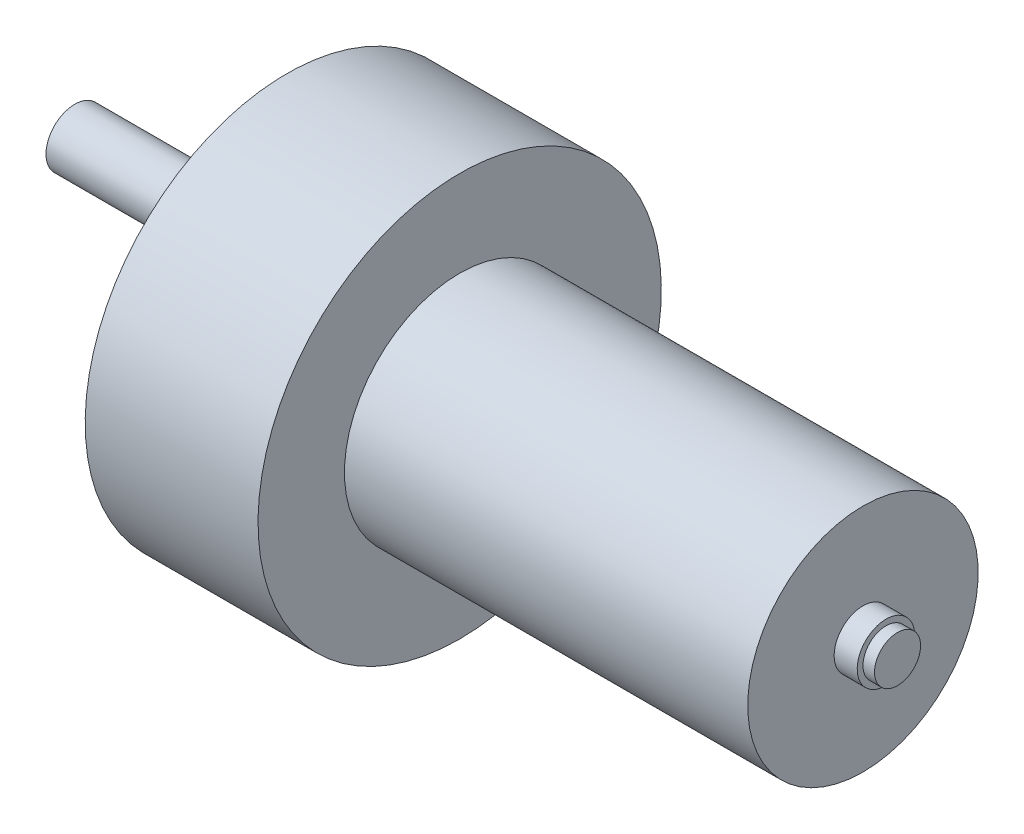
ISO-10303-21;
HEADER;
FILE_DESCRIPTION(('STEP AP214'),'2;1');
FILE_NAME('part.step','',(''),(''),'','','');
FILE_SCHEMA(('AUTOMOTIVE_DESIGN { 1 0 10303 214 1 1 1 1 }'));
ENDSEC;
DATA;
#1=APPLICATION_CONTEXT('core data for automotive mechanical design processes');
#2=APPLICATION_PROTOCOL_DEFINITION('international standard','automotive_design',2000,#1);
#3=PRODUCT_CONTEXT('',#1,'mechanical');
#4=PRODUCT('Part','Part','',(#3));
#5=PRODUCT_RELATED_PRODUCT_CATEGORY('part','',(#4));
#6=PRODUCT_DEFINITION_FORMATION('','',#4);
#7=PRODUCT_DEFINITION_CONTEXT('part definition',#1,'design');
#8=PRODUCT_DEFINITION('design','',#6,#7);
#9=PRODUCT_DEFINITION_SHAPE('','',#8);
#10=(LENGTH_UNIT() NAMED_UNIT(*) SI_UNIT(.MILLI.,.METRE.));
#11=(NAMED_UNIT(*) PLANE_ANGLE_UNIT() SI_UNIT($,.RADIAN.));
#12=(NAMED_UNIT(*) SI_UNIT($,.STERADIAN.) SOLID_ANGLE_UNIT());
#13=UNCERTAINTY_MEASURE_WITH_UNIT(LENGTH_MEASURE(1.E-05),#10,'distance_accuracy_value','');
#14=(GEOMETRIC_REPRESENTATION_CONTEXT(3) GLOBAL_UNCERTAINTY_ASSIGNED_CONTEXT((#13)) GLOBAL_UNIT_ASSIGNED_CONTEXT((#10,
#11,#12)) REPRESENTATION_CONTEXT('',''));
#15=CARTESIAN_POINT('',(0.,0.,0.));
#16=DIRECTION('',(0.,0.,1.));
#17=DIRECTION('',(1.,0.,0.));
#18=AXIS2_PLACEMENT_3D('',#15,#16,#17);
#19=CARTESIAN_POINT('',(-33.699317515393,0.,0.));
#20=DIRECTION('',(-1.,0.,0.));
#21=DIRECTION('',(0.,-1.,0.));
#22=AXIS2_PLACEMENT_3D('',#19,#20,#21);
#23=CYLINDRICAL_SURFACE('',#22,20.);
#24=CARTESIAN_POINT('',(66.300682484607,0.,0.));
#25=DIRECTION('',(-1.,0.,0.));
#26=DIRECTION('',(0.,-1.,0.));
#27=AXIS2_PLACEMENT_3D('',#24,#25,#26);
#28=CIRCLE('',#27,20.);
#29=CARTESIAN_POINT('',(66.300682484607,-20.,0.));
#30=VERTEX_POINT('',#29);
#31=EDGE_CURVE('E63',#30,#30,#28,.T.);
#32=ORIENTED_EDGE('',*,*,#31,.T.);
#33=EDGE_LOOP('',(#32));
#34=FACE_BOUND('',#33,.T.);
#35=CARTESIAN_POINT('',(-3.69931751539299,0.,0.));
#36=DIRECTION('',(-1.,0.,0.));
#37=DIRECTION('',(0.,-1.,0.));
#38=AXIS2_PLACEMENT_3D('',#35,#36,#37);
#39=CIRCLE('',#38,20.);
#40=CARTESIAN_POINT('',(-3.69931751539298,-20.,0.));
#41=VERTEX_POINT('',#40);
#42=EDGE_CURVE('E38',#41,#41,#39,.T.);
#43=ORIENTED_EDGE('',*,*,#42,.F.);
#44=EDGE_LOOP('',(#43));
#45=FACE_BOUND('',#44,.T.);
#46=ADVANCED_FACE('F32',(#34,#45),#23,.T.);
#47=CARTESIAN_POINT('',(-3.69931751539299,0.,0.));
#48=DIRECTION('',(1.,0.,0.));
#49=DIRECTION('',(0.,1.,0.));
#50=AXIS2_PLACEMENT_3D('',#47,#48,#49);
#51=PLANE('',#50);
#52=ORIENTED_EDGE('',*,*,#42,.T.);
#53=EDGE_LOOP('',(#52));
#54=FACE_BOUND('',#53,.T.);
#55=CARTESIAN_POINT('',(-3.69931751539299,0.,0.));
#56=DIRECTION('',(-1.,0.,0.));
#57=DIRECTION('',(0.,-1.,0.));
#58=AXIS2_PLACEMENT_3D('',#55,#56,#57);
#59=CIRCLE('',#58,35.);
#60=CARTESIAN_POINT('',(-3.69931751539298,-35.,0.));
#61=VERTEX_POINT('',#60);
#62=EDGE_CURVE('E42',#61,#61,#59,.T.);
#63=ORIENTED_EDGE('',*,*,#62,.F.);
#64=EDGE_LOOP('',(#63));
#65=FACE_BOUND('',#64,.T.);
#66=ADVANCED_FACE('F141',(#54,#65),#51,.T.);
#67=CARTESIAN_POINT('',(-33.699317515393,0.,0.));
#68=DIRECTION('',(-1.,0.,0.));
#69=DIRECTION('',(0.,-1.,0.));
#70=AXIS2_PLACEMENT_3D('',#67,#68,#69);
#71=CYLINDRICAL_SURFACE('',#70,35.);
#72=ORIENTED_EDGE('',*,*,#62,.T.);
#73=EDGE_LOOP('',(#72));
#74=FACE_BOUND('',#73,.T.);
#75=CARTESIAN_POINT('',(-33.699317515393,0.,0.));
#76=DIRECTION('',(-1.,0.,0.));
#77=DIRECTION('',(0.,-1.,0.));
#78=AXIS2_PLACEMENT_3D('',#75,#76,#77);
#79=CIRCLE('',#78,35.);
#80=CARTESIAN_POINT('',(-33.699317515393,-35.,0.));
#81=VERTEX_POINT('',#80);
#82=EDGE_CURVE('E46',#81,#81,#79,.T.);
#83=ORIENTED_EDGE('',*,*,#82,.F.);
#84=EDGE_LOOP('',(#83));
#85=FACE_BOUND('',#84,.T.);
#86=ADVANCED_FACE('F125',(#74,#85),#71,.T.);
#87=CARTESIAN_POINT('',(-33.699317515393,0.,0.));
#88=DIRECTION('',(1.,0.,0.));
#89=DIRECTION('',(0.,1.,0.));
#90=AXIS2_PLACEMENT_3D('',#87,#88,#89);
#91=PLANE('',#90);
#92=CARTESIAN_POINT('',(-33.699317515393,13.6399001096049,-7.87499999999997));
#93=DIRECTION('',(-1.,0.,0.));
#94=DIRECTION('',(0.,0.,1.));
#95=AXIS2_PLACEMENT_3D('',#92,#93,#94);
#96=CIRCLE('',#95,1.5);
#97=CARTESIAN_POINT('',(-33.699317515393,13.6399001096049,-6.37499999999997));
#98=VERTEX_POINT('',#97);
#99=EDGE_CURVE('E106',#98,#98,#96,.T.);
#100=ORIENTED_EDGE('',*,*,#99,.F.);
#101=EDGE_LOOP('',(#100));
#102=FACE_BOUND('',#101,.T.);
#103=CARTESIAN_POINT('',(-33.699317515393,13.6399001096049,7.87500000000006));
#104=DIRECTION('',(-1.,0.,0.));
#105=DIRECTION('',(0.,0.,1.));
#106=AXIS2_PLACEMENT_3D('',#103,#104,#105);
#107=CIRCLE('',#106,1.5);
#108=CARTESIAN_POINT('',(-33.699317515393,13.6399001096049,9.37500000000007));
#109=VERTEX_POINT('',#108);
#110=EDGE_CURVE('E100',#109,#109,#107,.T.);
#111=ORIENTED_EDGE('',*,*,#110,.F.);
#112=EDGE_LOOP('',(#111));
#113=FACE_BOUND('',#112,.T.);
#114=CARTESIAN_POINT('',(-33.699317515393,-1.18955138156214E-13,15.75));
#115=DIRECTION('',(-1.,0.,0.));
#116=DIRECTION('',(0.,0.,1.));
#117=AXIS2_PLACEMENT_3D('',#114,#115,#116);
#118=CIRCLE('',#117,1.5);
#119=CARTESIAN_POINT('',(-33.699317515393,-1.18955138156214E-13,17.25));
#120=VERTEX_POINT('',#119);
#121=EDGE_CURVE('E94',#120,#120,#118,.T.);
#122=ORIENTED_EDGE('',*,*,#121,.F.);
#123=EDGE_LOOP('',(#122));
#124=FACE_BOUND('',#123,.T.);
#125=CARTESIAN_POINT('',(-33.699317515393,-13.639900109605,7.87499999999987));
#126=DIRECTION('',(-1.,0.,0.));
#127=DIRECTION('',(0.,0.,1.));
#128=AXIS2_PLACEMENT_3D('',#125,#126,#127);
#129=CIRCLE('',#128,1.5);
#130=CARTESIAN_POINT('',(-33.699317515393,-13.639900109605,9.37499999999987));
#131=VERTEX_POINT('',#130);
#132=EDGE_CURVE('E88',#131,#131,#129,.T.);
#133=ORIENTED_EDGE('',*,*,#132,.F.);
#134=EDGE_LOOP('',(#133));
#135=FACE_BOUND('',#134,.T.);
#136=CARTESIAN_POINT('',(-33.699317515393,-13.6399001096048,-7.87500000000016));
#137=DIRECTION('',(-1.,0.,0.));
#138=DIRECTION('',(0.,0.,1.));
#139=AXIS2_PLACEMENT_3D('',#136,#137,#138);
#140=CIRCLE('',#139,1.5);
#141=CARTESIAN_POINT('',(-33.699317515393,-13.6399001096048,-6.37500000000016));
#142=VERTEX_POINT('',#141);
#143=EDGE_CURVE('E82',#142,#142,#140,.T.);
#144=ORIENTED_EDGE('',*,*,#143,.F.);
#145=EDGE_LOOP('',(#144));
#146=FACE_BOUND('',#145,.T.);
#147=CARTESIAN_POINT('',(-33.699317515393,0.,-15.75));
#148=DIRECTION('',(-1.,0.,0.));
#149=DIRECTION('',(0.,0.,1.));
#150=AXIS2_PLACEMENT_3D('',#147,#148,#149);
#151=CIRCLE('',#150,1.5);
#152=CARTESIAN_POINT('',(-33.699317515393,0.,-14.25));
#153=VERTEX_POINT('',#152);
#154=EDGE_CURVE('E76',#153,#153,#151,.T.);
#155=ORIENTED_EDGE('',*,*,#154,.F.);
#156=EDGE_LOOP('',(#155));
#157=FACE_BOUND('',#156,.T.);
#158=CARTESIAN_POINT('',(-33.699317515393,6.99999999999999,0.));
#159=DIRECTION('',(1.,0.,0.));
#160=DIRECTION('',(0.,1.,0.));
#161=AXIS2_PLACEMENT_3D('',#158,#159,#160);
#162=CIRCLE('',#161,6.);
#163=CARTESIAN_POINT('',(-33.699317515393,13.,0.));
#164=VERTEX_POINT('',#163);
#165=EDGE_CURVE('E10',#164,#164,#162,.F.);
#166=ORIENTED_EDGE('',*,*,#165,.F.);
#167=EDGE_LOOP('',(#166));
#168=FACE_BOUND('',#167,.T.);
#169=ORIENTED_EDGE('',*,*,#82,.T.);
#170=EDGE_LOOP('',(#169));
#171=FACE_BOUND('',#170,.T.);
#172=ADVANCED_FACE('F121',(#102,#113,#124,#135,#146,#157,#168,#171),#91,.F.);
#173=CARTESIAN_POINT('',(72.300682484607,0.,0.));
#174=DIRECTION('',(-1.,0.,0.));
#175=DIRECTION('',(0.,-1.,0.));
#176=AXIS2_PLACEMENT_3D('',#173,#174,#175);
#177=PLANE('',#176);
#178=CARTESIAN_POINT('',(72.300682484607,0.,0.));
#179=DIRECTION('',(-1.,0.,0.));
#180=DIRECTION('',(0.,-1.,0.));
#181=AXIS2_PLACEMENT_3D('',#178,#179,#180);
#182=CIRCLE('',#181,3.99999999999997);
#183=CARTESIAN_POINT('',(72.300682484607,-3.99999999999998,0.));
#184=VERTEX_POINT('',#183);
#185=EDGE_CURVE('E51',#184,#184,#182,.T.);
#186=ORIENTED_EDGE('',*,*,#185,.F.);
#187=EDGE_LOOP('',(#186));
#188=FACE_BOUND('',#187,.T.);
#189=ADVANCED_FACE('F124',(#188),#177,.F.);
#190=CARTESIAN_POINT('',(-33.699317515393,0.,0.));
#191=DIRECTION('',(-1.,0.,0.));
#192=DIRECTION('',(0.,-1.,0.));
#193=AXIS2_PLACEMENT_3D('',#190,#191,#192);
#194=CYLINDRICAL_SURFACE('',#193,3.99999999999997);
#195=CARTESIAN_POINT('',(70.300682484607,0.,0.));
#196=DIRECTION('',(-1.,0.,0.));
#197=DIRECTION('',(0.,-1.,0.));
#198=AXIS2_PLACEMENT_3D('',#195,#196,#197);
#199=CIRCLE('',#198,3.99999999999997);
#200=CARTESIAN_POINT('',(70.300682484607,-3.99999999999998,0.));
#201=VERTEX_POINT('',#200);
#202=EDGE_CURVE('E54',#201,#201,#199,.T.);
#203=ORIENTED_EDGE('',*,*,#202,.F.);
#204=EDGE_LOOP('',(#203));
#205=FACE_BOUND('',#204,.T.);
#206=ORIENTED_EDGE('',*,*,#185,.T.);
#207=EDGE_LOOP('',(#206));
#208=FACE_BOUND('',#207,.T.);
#209=ADVANCED_FACE('F174',(#205,#208),#194,.T.);
#210=CARTESIAN_POINT('',(70.300682484607,0.,0.));
#211=DIRECTION('',(1.,0.,0.));
#212=DIRECTION('',(0.,1.,0.));
#213=AXIS2_PLACEMENT_3D('',#210,#211,#212);
#214=PLANE('',#213);
#215=ORIENTED_EDGE('',*,*,#202,.T.);
#216=EDGE_LOOP('',(#215));
#217=FACE_BOUND('',#216,.T.);
#218=CARTESIAN_POINT('',(70.300682484607,0.,0.));
#219=DIRECTION('',(-1.,0.,0.));
#220=DIRECTION('',(0.,-1.,0.));
#221=AXIS2_PLACEMENT_3D('',#218,#219,#220);
#222=CIRCLE('',#221,5.00000000000001);
#223=CARTESIAN_POINT('',(70.300682484607,-5.00000000000002,0.));
#224=VERTEX_POINT('',#223);
#225=EDGE_CURVE('E57',#224,#224,#222,.T.);
#226=ORIENTED_EDGE('',*,*,#225,.F.);
#227=EDGE_LOOP('',(#226));
#228=FACE_BOUND('',#227,.T.);
#229=ADVANCED_FACE('F167',(#217,#228),#214,.T.);
#230=CARTESIAN_POINT('',(-33.699317515393,0.,0.));
#231=DIRECTION('',(-1.,0.,0.));
#232=DIRECTION('',(0.,-1.,0.));
#233=AXIS2_PLACEMENT_3D('',#230,#231,#232);
#234=CYLINDRICAL_SURFACE('',#233,5.00000000000001);
#235=ORIENTED_EDGE('',*,*,#225,.T.);
#236=EDGE_LOOP('',(#235));
#237=FACE_BOUND('',#236,.T.);
#238=CARTESIAN_POINT('',(66.300682484607,0.,0.));
#239=DIRECTION('',(-1.,0.,0.));
#240=DIRECTION('',(0.,-1.,0.));
#241=AXIS2_PLACEMENT_3D('',#238,#239,#240);
#242=CIRCLE('',#241,5.00000000000001);
#243=CARTESIAN_POINT('',(66.300682484607,-5.00000000000002,0.));
#244=VERTEX_POINT('',#243);
#245=EDGE_CURVE('E60',#244,#244,#242,.T.);
#246=ORIENTED_EDGE('',*,*,#245,.F.);
#247=EDGE_LOOP('',(#246));
#248=FACE_BOUND('',#247,.T.);
#249=ADVANCED_FACE('F157',(#237,#248),#234,.T.);
#250=CARTESIAN_POINT('',(66.300682484607,0.,0.));
#251=DIRECTION('',(1.,0.,0.));
#252=DIRECTION('',(0.,1.,0.));
#253=AXIS2_PLACEMENT_3D('',#250,#251,#252);
#254=PLANE('',#253);
#255=ORIENTED_EDGE('',*,*,#245,.T.);
#256=EDGE_LOOP('',(#255));
#257=FACE_BOUND('',#256,.T.);
#258=ORIENTED_EDGE('',*,*,#31,.F.);
#259=EDGE_LOOP('',(#258));
#260=FACE_BOUND('',#259,.T.);
#261=ADVANCED_FACE('F154',(#257,#260),#254,.T.);
#262=CARTESIAN_POINT('',(-40.499317515393,6.99999999999999,0.));
#263=DIRECTION('',(1.,0.,0.));
#264=DIRECTION('',(0.,0.,-1.));
#265=AXIS2_PLACEMENT_3D('',#262,#263,#264);
#266=CYLINDRICAL_SURFACE('',#265,6.);
#267=CARTESIAN_POINT('',(-40.499317515393,6.99999999999999,0.));
#268=DIRECTION('',(-1.,0.,0.));
#269=DIRECTION('',(0.,0.,1.));
#270=AXIS2_PLACEMENT_3D('',#267,#268,#269);
#271=CIRCLE('',#270,6.);
#272=CARTESIAN_POINT('',(-40.499317515393,6.99999999999999,6.));
#273=VERTEX_POINT('',#272);
#274=EDGE_CURVE('E66',#273,#273,#271,.T.);
#275=ORIENTED_EDGE('',*,*,#274,.F.);
#276=EDGE_LOOP('',(#275));
#277=FACE_BOUND('',#276,.T.);
#278=ORIENTED_EDGE('',*,*,#165,.T.);
#279=EDGE_LOOP('',(#278));
#280=FACE_BOUND('',#279,.T.);
#281=ADVANCED_FACE('F156',(#277,#280),#266,.T.);
#282=CARTESIAN_POINT('',(-40.499317515393,6.99999999999999,0.));
#283=DIRECTION('',(-1.,0.,0.));
#284=DIRECTION('',(0.,0.,1.));
#285=AXIS2_PLACEMENT_3D('',#282,#283,#284);
#286=PLANE('',#285);
#287=CARTESIAN_POINT('',(-40.499317515393,7.,0.));
#288=DIRECTION('',(-1.,0.,0.));
#289=DIRECTION('',(0.,0.,1.));
#290=AXIS2_PLACEMENT_3D('',#287,#288,#289);
#291=CIRCLE('',#290,5.);
#292=CARTESIAN_POINT('',(-40.499317515393,7.,5.));
#293=VERTEX_POINT('',#292);
#294=EDGE_CURVE('E70',#293,#293,#291,.T.);
#295=ORIENTED_EDGE('',*,*,#294,.F.);
#296=EDGE_LOOP('',(#295));
#297=FACE_BOUND('',#296,.T.);
#298=ORIENTED_EDGE('',*,*,#274,.T.);
#299=EDGE_LOOP('',(#298));
#300=FACE_BOUND('',#299,.T.);
#301=ADVANCED_FACE('F164',(#297,#300),#286,.T.);
#302=CARTESIAN_POINT('',(-70.499317515393,7.,0.));
#303=DIRECTION('',(1.,0.,0.));
#304=DIRECTION('',(0.,0.,-1.));
#305=AXIS2_PLACEMENT_3D('',#302,#303,#304);
#306=CYLINDRICAL_SURFACE('',#305,5.);
#307=CARTESIAN_POINT('',(-70.499317515393,7.,0.));
#308=DIRECTION('',(-1.,0.,0.));
#309=DIRECTION('',(0.,0.,1.));
#310=AXIS2_PLACEMENT_3D('',#307,#308,#309);
#311=CIRCLE('',#310,5.);
#312=CARTESIAN_POINT('',(-70.499317515393,7.,5.));
#313=VERTEX_POINT('',#312);
#314=EDGE_CURVE('E69',#313,#313,#311,.T.);
#315=ORIENTED_EDGE('',*,*,#314,.F.);
#316=EDGE_LOOP('',(#315));
#317=FACE_BOUND('',#316,.T.);
#318=ORIENTED_EDGE('',*,*,#294,.T.);
#319=EDGE_LOOP('',(#318));
#320=FACE_BOUND('',#319,.T.);
#321=ADVANCED_FACE('F219',(#317,#320),#306,.T.);
#322=CARTESIAN_POINT('',(-70.499317515393,7.,0.));
#323=DIRECTION('',(-1.,0.,0.));
#324=DIRECTION('',(0.,0.,1.));
#325=AXIS2_PLACEMENT_3D('',#322,#323,#324);
#326=PLANE('',#325);
#327=ORIENTED_EDGE('',*,*,#314,.T.);
#328=EDGE_LOOP('',(#327));
#329=FACE_BOUND('',#328,.T.);
#330=ADVANCED_FACE('F228',(#329),#326,.T.);
#331=CARTESIAN_POINT('',(-30.699317515393,0.,-15.75));
#332=DIRECTION('',(-1.,0.,0.));
#333=DIRECTION('',(0.,0.,1.));
#334=AXIS2_PLACEMENT_3D('',#331,#332,#333);
#335=CYLINDRICAL_SURFACE('',#334,1.5);
#336=CARTESIAN_POINT('',(-30.699317515393,0.,-15.75));
#337=DIRECTION('',(-1.,0.,0.));
#338=DIRECTION('',(0.,0.,1.));
#339=AXIS2_PLACEMENT_3D('',#336,#337,#338);
#340=CIRCLE('',#339,1.5);
#341=CARTESIAN_POINT('',(-30.699317515393,0.,-14.25));
#342=VERTEX_POINT('',#341);
#343=EDGE_CURVE('E73',#342,#342,#340,.T.);
#344=ORIENTED_EDGE('',*,*,#343,.F.);
#345=EDGE_LOOP('',(#344));
#346=FACE_BOUND('',#345,.T.);
#347=ORIENTED_EDGE('',*,*,#154,.T.);
#348=EDGE_LOOP('',(#347));
#349=FACE_BOUND('',#348,.T.);
#350=ADVANCED_FACE('F237',(#346,#349),#335,.F.);
#351=CARTESIAN_POINT('',(-30.699317515393,0.,-15.75));
#352=DIRECTION('',(-1.,0.,0.));
#353=DIRECTION('',(0.,0.,1.));
#354=AXIS2_PLACEMENT_3D('',#351,#352,#353);
#355=PLANE('',#354);
#356=ORIENTED_EDGE('',*,*,#343,.T.);
#357=EDGE_LOOP('',(#356));
#358=FACE_BOUND('',#357,.T.);
#359=ADVANCED_FACE('F253',(#358),#355,.T.);
#360=CARTESIAN_POINT('',(-30.699317515393,-13.6399001096048,-7.87500000000016));
#361=DIRECTION('',(-1.,0.,0.));
#362=DIRECTION('',(0.,0.,1.));
#363=AXIS2_PLACEMENT_3D('',#360,#361,#362);
#364=CYLINDRICAL_SURFACE('',#363,1.5);
#365=CARTESIAN_POINT('',(-30.699317515393,-13.6399001096048,-7.87500000000016));
#366=DIRECTION('',(-1.,0.,0.));
#367=DIRECTION('',(0.,0.,1.));
#368=AXIS2_PLACEMENT_3D('',#365,#366,#367);
#369=CIRCLE('',#368,1.5);
#370=CARTESIAN_POINT('',(-30.699317515393,-13.6399001096048,-6.37500000000016));
#371=VERTEX_POINT('',#370);
#372=EDGE_CURVE('E85',#371,#371,#369,.T.);
#373=ORIENTED_EDGE('',*,*,#372,.F.);
#374=EDGE_LOOP('',(#373));
#375=FACE_BOUND('',#374,.T.);
#376=ORIENTED_EDGE('',*,*,#143,.T.);
#377=EDGE_LOOP('',(#376));
#378=FACE_BOUND('',#377,.T.);
#379=ADVANCED_FACE('F263',(#375,#378),#364,.F.);
#380=CARTESIAN_POINT('',(-30.699317515393,-13.6399001096048,-7.87500000000016));
#381=DIRECTION('',(-1.,0.,0.));
#382=DIRECTION('',(0.,0.,1.));
#383=AXIS2_PLACEMENT_3D('',#380,#381,#382);
#384=PLANE('',#383);
#385=ORIENTED_EDGE('',*,*,#372,.T.);
#386=EDGE_LOOP('',(#385));
#387=FACE_BOUND('',#386,.T.);
#388=ADVANCED_FACE('F273',(#387),#384,.T.);
#389=CARTESIAN_POINT('',(-30.699317515393,-13.639900109605,7.87499999999987));
#390=DIRECTION('',(-1.,0.,0.));
#391=DIRECTION('',(0.,0.,1.));
#392=AXIS2_PLACEMENT_3D('',#389,#390,#391);
#393=CYLINDRICAL_SURFACE('',#392,1.5);
#394=CARTESIAN_POINT('',(-30.699317515393,-13.639900109605,7.87499999999987));
#395=DIRECTION('',(-1.,0.,0.));
#396=DIRECTION('',(0.,0.,1.));
#397=AXIS2_PLACEMENT_3D('',#394,#395,#396);
#398=CIRCLE('',#397,1.5);
#399=CARTESIAN_POINT('',(-30.699317515393,-13.639900109605,9.37499999999987));
#400=VERTEX_POINT('',#399);
#401=EDGE_CURVE('E91',#400,#400,#398,.T.);
#402=ORIENTED_EDGE('',*,*,#401,.F.);
#403=EDGE_LOOP('',(#402));
#404=FACE_BOUND('',#403,.T.);
#405=ORIENTED_EDGE('',*,*,#132,.T.);
#406=EDGE_LOOP('',(#405));
#407=FACE_BOUND('',#406,.T.);
#408=ADVANCED_FACE('F283',(#404,#407),#393,.F.);
#409=CARTESIAN_POINT('',(-30.699317515393,-13.639900109605,7.87499999999987));
#410=DIRECTION('',(-1.,0.,0.));
#411=DIRECTION('',(0.,0.,1.));
#412=AXIS2_PLACEMENT_3D('',#409,#410,#411);
#413=PLANE('',#412);
#414=ORIENTED_EDGE('',*,*,#401,.T.);
#415=EDGE_LOOP('',(#414));
#416=FACE_BOUND('',#415,.T.);
#417=ADVANCED_FACE('F293',(#416),#413,.T.);
#418=CARTESIAN_POINT('',(-30.699317515393,-1.18955138156214E-13,15.75));
#419=DIRECTION('',(-1.,0.,0.));
#420=DIRECTION('',(0.,0.,1.));
#421=AXIS2_PLACEMENT_3D('',#418,#419,#420);
#422=CYLINDRICAL_SURFACE('',#421,1.5);
#423=CARTESIAN_POINT('',(-30.699317515393,-1.18955138156214E-13,15.75));
#424=DIRECTION('',(-1.,0.,0.));
#425=DIRECTION('',(0.,0.,1.));
#426=AXIS2_PLACEMENT_3D('',#423,#424,#425);
#427=CIRCLE('',#426,1.5);
#428=CARTESIAN_POINT('',(-30.699317515393,-1.18955138156214E-13,17.25));
#429=VERTEX_POINT('',#428);
#430=EDGE_CURVE('E97',#429,#429,#427,.T.);
#431=ORIENTED_EDGE('',*,*,#430,.F.);
#432=EDGE_LOOP('',(#431));
#433=FACE_BOUND('',#432,.T.);
#434=ORIENTED_EDGE('',*,*,#121,.T.);
#435=EDGE_LOOP('',(#434));
#436=FACE_BOUND('',#435,.T.);
#437=ADVANCED_FACE('F303',(#433,#436),#422,.F.);
#438=CARTESIAN_POINT('',(-30.699317515393,-1.18955138156214E-13,15.75));
#439=DIRECTION('',(-1.,0.,0.));
#440=DIRECTION('',(0.,0.,1.));
#441=AXIS2_PLACEMENT_3D('',#438,#439,#440);
#442=PLANE('',#441);
#443=ORIENTED_EDGE('',*,*,#430,.T.);
#444=EDGE_LOOP('',(#443));
#445=FACE_BOUND('',#444,.T.);
#446=ADVANCED_FACE('F313',(#445),#442,.T.);
#447=CARTESIAN_POINT('',(-30.699317515393,13.6399001096049,7.87500000000006));
#448=DIRECTION('',(-1.,0.,0.));
#449=DIRECTION('',(0.,0.,1.));
#450=AXIS2_PLACEMENT_3D('',#447,#448,#449);
#451=CYLINDRICAL_SURFACE('',#450,1.5);
#452=CARTESIAN_POINT('',(-30.699317515393,13.6399001096049,7.87500000000006));
#453=DIRECTION('',(-1.,0.,0.));
#454=DIRECTION('',(0.,0.,1.));
#455=AXIS2_PLACEMENT_3D('',#452,#453,#454);
#456=CIRCLE('',#455,1.5);
#457=CARTESIAN_POINT('',(-30.699317515393,13.6399001096049,9.37500000000007));
#458=VERTEX_POINT('',#457);
#459=EDGE_CURVE('E103',#458,#458,#456,.T.);
#460=ORIENTED_EDGE('',*,*,#459,.F.);
#461=EDGE_LOOP('',(#460));
#462=FACE_BOUND('',#461,.T.);
#463=ORIENTED_EDGE('',*,*,#110,.T.);
#464=EDGE_LOOP('',(#463));
#465=FACE_BOUND('',#464,.T.);
#466=ADVANCED_FACE('F323',(#462,#465),#451,.F.);
#467=CARTESIAN_POINT('',(-30.699317515393,13.6399001096049,7.87500000000006));
#468=DIRECTION('',(-1.,0.,0.));
#469=DIRECTION('',(0.,0.,1.));
#470=AXIS2_PLACEMENT_3D('',#467,#468,#469);
#471=PLANE('',#470);
#472=ORIENTED_EDGE('',*,*,#459,.T.);
#473=EDGE_LOOP('',(#472));
#474=FACE_BOUND('',#473,.T.);
#475=ADVANCED_FACE('F117',(#474),#471,.T.);
#476=CARTESIAN_POINT('',(-30.699317515393,13.6399001096049,-7.87499999999997));
#477=DIRECTION('',(-1.,0.,0.));
#478=DIRECTION('',(0.,0.,1.));
#479=AXIS2_PLACEMENT_3D('',#476,#477,#478);
#480=CYLINDRICAL_SURFACE('',#479,1.5);
#481=CARTESIAN_POINT('',(-30.699317515393,13.6399001096049,-7.87499999999997));
#482=DIRECTION('',(-1.,0.,0.));
#483=DIRECTION('',(0.,0.,1.));
#484=AXIS2_PLACEMENT_3D('',#481,#482,#483);
#485=CIRCLE('',#484,1.5);
#486=CARTESIAN_POINT('',(-30.699317515393,13.6399001096049,-6.37499999999997));
#487=VERTEX_POINT('',#486);
#488=EDGE_CURVE('E79',#487,#487,#485,.T.);
#489=ORIENTED_EDGE('',*,*,#488,.F.);
#490=EDGE_LOOP('',(#489));
#491=FACE_BOUND('',#490,.T.);
#492=ORIENTED_EDGE('',*,*,#99,.T.);
#493=EDGE_LOOP('',(#492));
#494=FACE_BOUND('',#493,.T.);
#495=ADVANCED_FACE('F114',(#491,#494),#480,.F.);
#496=CARTESIAN_POINT('',(-30.699317515393,13.6399001096049,-7.87499999999997));
#497=DIRECTION('',(-1.,0.,0.));
#498=DIRECTION('',(0.,0.,1.));
#499=AXIS2_PLACEMENT_3D('',#496,#497,#498);
#500=PLANE('',#499);
#501=ORIENTED_EDGE('',*,*,#488,.T.);
#502=EDGE_LOOP('',(#501));
#503=FACE_BOUND('',#502,.T.);
#504=ADVANCED_FACE('F112',(#503),#500,.T.);
#505=CLOSED_SHELL('',(#46,#66,#86,#172,#189,#209,#229,#249,#261,#281,#301,#321,#330,#350,#359,
#379,#388,#408,#417,#437,#446,#466,#475,#495,#504));
#506=MANIFOLD_SOLID_BREP('B2',#505);
#507=ADVANCED_BREP_SHAPE_REPRESENTATION('',(#18,#506),#14);
#508=SHAPE_DEFINITION_REPRESENTATION(#9,#507);
ENDSEC;
END-ISO-10303-21;
